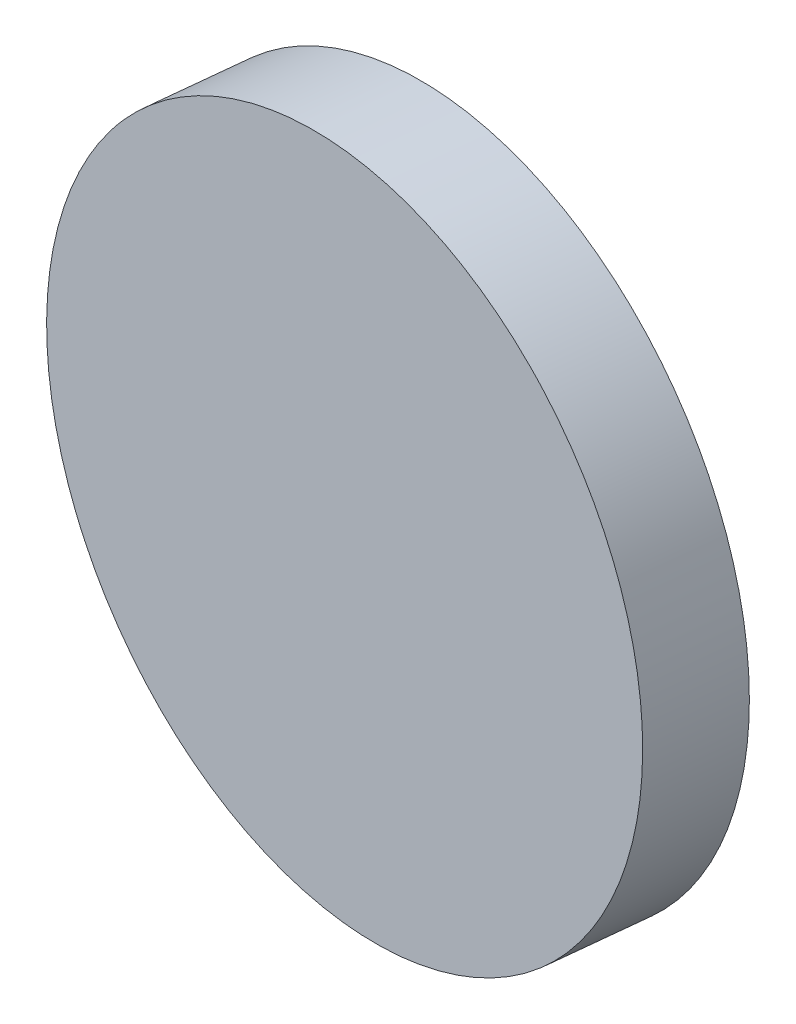
ISO-10303-21;
HEADER;
FILE_DESCRIPTION(('STEP AP214'),'2;1');
FILE_NAME('part.step','',(''),(''),'','','');
FILE_SCHEMA(('AUTOMOTIVE_DESIGN { 1 0 10303 214 1 1 1 1 }'));
ENDSEC;
DATA;
#1=APPLICATION_CONTEXT('core data for automotive mechanical design processes');
#2=APPLICATION_PROTOCOL_DEFINITION('international standard','automotive_design',2000,#1);
#3=PRODUCT_CONTEXT('',#1,'mechanical');
#4=PRODUCT('Part','Part','',(#3));
#5=PRODUCT_RELATED_PRODUCT_CATEGORY('part','',(#4));
#6=PRODUCT_DEFINITION_FORMATION('','',#4);
#7=PRODUCT_DEFINITION_CONTEXT('part definition',#1,'design');
#8=PRODUCT_DEFINITION('design','',#6,#7);
#9=PRODUCT_DEFINITION_SHAPE('','',#8);
#10=(LENGTH_UNIT() NAMED_UNIT(*) SI_UNIT(.MILLI.,.METRE.));
#11=(NAMED_UNIT(*) PLANE_ANGLE_UNIT() SI_UNIT($,.RADIAN.));
#12=(NAMED_UNIT(*) SI_UNIT($,.STERADIAN.) SOLID_ANGLE_UNIT());
#13=UNCERTAINTY_MEASURE_WITH_UNIT(LENGTH_MEASURE(1.E-05),#10,'distance_accuracy_value','');
#14=(GEOMETRIC_REPRESENTATION_CONTEXT(3) GLOBAL_UNCERTAINTY_ASSIGNED_CONTEXT((#13)) GLOBAL_UNIT_ASSIGNED_CONTEXT((#10,
#11,#12)) REPRESENTATION_CONTEXT('',''));
#15=CARTESIAN_POINT('',(0.,0.,0.));
#16=DIRECTION('',(0.,0.,1.));
#17=DIRECTION('',(1.,0.,0.));
#18=AXIS2_PLACEMENT_3D('',#15,#16,#17);
#19=CARTESIAN_POINT('',(81.5802850938321,190.866099823162,216.36105763102));
#20=CARTESIAN_POINT('',(81.5802850938321,191.240465528175,216.36105763102));
#21=CARTESIAN_POINT('',(81.5069454617178,191.989196938201,216.353349325072));
#22=CARTESIAN_POINT('',(81.1811447186027,193.06913406095,216.319106287118));
#23=CARTESIAN_POINT('',(80.6520730203906,194.064409813416,216.263498610877));
#24=CARTESIAN_POINT('',(79.9400622957371,194.93677630659,216.188663268161));
#25=CARTESIAN_POINT('',(79.0724747174903,195.652708985367,216.097476139224));
#26=CARTESIAN_POINT('',(78.0826511897335,196.184694958402,215.993441494291));
#27=CARTESIAN_POINT('',(77.0086300755391,196.512290303092,215.880557326424));
#28=CARTESIAN_POINT('',(75.8916854040075,196.622905714059,215.763161710889));
#29=CARTESIAN_POINT('',(74.7747407324759,196.512290303092,215.645766095353));
#30=CARTESIAN_POINT('',(73.7007196182815,196.184694958402,215.532881927487));
#31=CARTESIAN_POINT('',(72.7108960905247,195.652708985367,215.428847282554));
#32=CARTESIAN_POINT('',(71.8433085122779,194.93677630659,215.337660153616));
#33=CARTESIAN_POINT('',(71.1312977876244,194.064409813416,215.262824810901));
#34=CARTESIAN_POINT('',(70.6022260894123,193.06913406095,215.207217134659));
#35=CARTESIAN_POINT('',(70.2764253462972,191.989196938201,215.172974096705));
#36=CARTESIAN_POINT('',(70.1664158981257,190.866099823162,215.161411637783));
#37=CARTESIAN_POINT('',(70.2764253462972,189.743002708123,215.172974096705));
#38=CARTESIAN_POINT('',(70.6022260894123,188.663065585374,215.207217134659));
#39=CARTESIAN_POINT('',(71.1312977876244,187.667789832908,215.2628248109));
#40=CARTESIAN_POINT('',(71.8433085122779,186.795423339734,215.337660153616));
#41=CARTESIAN_POINT('',(72.7108960905248,186.079490660957,215.428847282554));
#42=CARTESIAN_POINT('',(73.7007196182815,185.547504687922,215.532881927487));
#43=CARTESIAN_POINT('',(74.7747407324759,185.219909343232,215.645766095353));
#44=CARTESIAN_POINT('',(75.8916854040075,185.109293932265,215.763161710889));
#45=CARTESIAN_POINT('',(77.0086300755391,185.219909343232,215.880557326424));
#46=CARTESIAN_POINT('',(78.0826511897336,185.547504687922,215.993441494291));
#47=CARTESIAN_POINT('',(79.0724747174903,186.079490660957,216.097476139223));
#48=CARTESIAN_POINT('',(79.9400622957371,186.795423339734,216.188663268161));
#49=CARTESIAN_POINT('',(80.6520730203906,187.667789832908,216.263498610877));
#50=CARTESIAN_POINT('',(81.1811447186027,188.663065585374,216.319106287118));
#51=CARTESIAN_POINT('',(81.5069454617179,189.743002708123,216.353349325072));
#52=CARTESIAN_POINT('',(81.5802850938322,190.491734118149,216.36105763102));
#53=CARTESIAN_POINT('',(81.5802850938321,190.866099823162,216.36105763102));
#54=B_SPLINE_CURVE_WITH_KNOTS('',3,(#19,#20,#21,#22,#23,#24,#25,#26,#27,#28,#29,#30,#31,#32,#33,
#34,#35,#36,#37,#38,#39,#40,#41,#42,#43,#44,#45,#46,#47,#48,#49,#50,#51,#52,#53),.UNSPECIFIED.,
.T.,.F.,(4,1,1,1,1,1,1,1,1,1,1,1,1,1,1,1,1,1,1,1,1,1,1,1,1,1,1,1,1,1,1,1,4),(0.,
0.0312499999999999,0.0625,0.09375,0.125,0.15625,0.1875,0.21875,0.25,0.28125,0.3125,0.34375,
0.375,0.40625,0.4375,0.46875,0.5,0.53125,0.5625,0.59375,0.625,0.65625,0.6875,0.71875,
0.750000000000001,0.78125,0.8125,0.84375,0.875,0.90625,0.9375,0.96875,1.),.UNSPECIFIED.);
#55=DIRECTION('',(-0.104528463267661,0.,0.994521895368273));
#56=VECTOR('',#55,1.);
#57=SURFACE_OF_LINEAR_EXTRUSION('',#54,#56);
#58=CARTESIAN_POINT('',(81.5802850938321,190.866099823162,216.36105763102));
#59=CARTESIAN_POINT('',(81.5802850340737,190.956855663651,216.361057624739));
#60=CARTESIAN_POINT('',(81.578129980323,191.047610899595,216.360831119463));
#61=CARTESIAN_POINT('',(81.5695298481299,191.228916404804,216.359927209146));
#62=CARTESIAN_POINT('',(81.5630847369138,191.319466672499,216.35924980066));
#63=CARTESIAN_POINT('',(81.5459244482851,191.500157147677,216.357446181647));
#64=CARTESIAN_POINT('',(81.5352092681802,191.590297354901,216.356319970836));
#65=CARTESIAN_POINT('',(81.5095294642833,191.769963271551,216.353620914686));
#66=CARTESIAN_POINT('',(81.4945648717012,191.859488985484,216.352048072626));
#67=CARTESIAN_POINT('',(81.4604038242494,192.0377202278,216.348457601858));
#68=CARTESIAN_POINT('',(81.4412073766645,192.126425757594,216.346439973915));
#69=CARTESIAN_POINT('',(81.3986385816101,192.302818386668,216.341965813265));
#70=CARTESIAN_POINT('',(81.3752662020898,192.390505478126,216.339509277189));
#71=CARTESIAN_POINT('',(81.3244056687212,192.564664551136,216.334163619724));
#72=CARTESIAN_POINT('',(81.2969175071506,192.651136530408,216.331274497523));
#73=CARTESIAN_POINT('',(81.2378854329528,192.822668878292,216.325069976508));
#74=CARTESIAN_POINT('',(81.2063415479988,192.90772925653,216.321754580603));
#75=CARTESIAN_POINT('',(81.1392539046912,193.076239760272,216.314703385157));
#76=CARTESIAN_POINT('',(81.1037101596968,193.159689891152,216.310967587021));
#77=CARTESIAN_POINT('',(81.0287116955588,193.324794465195,216.303084930802));
#78=CARTESIAN_POINT('',(80.9892569474129,193.406448895036,216.29893806967));
#79=CARTESIAN_POINT('',(80.9065346690166,193.567781384206,216.29024360786));
#80=CARTESIAN_POINT('',(80.863267127035,193.647459437454,216.285696005948));
#81=CARTESIAN_POINT('',(80.7730160847625,193.804658152998,216.276210239168));
#82=CARTESIAN_POINT('',(80.7260326071597,193.882178828463,216.271272076685));
#83=CARTESIAN_POINT('',(80.6284426810896,194.03487882202,216.261014962136));
#84=CARTESIAN_POINT('',(80.5778362499097,194.110058151281,216.255696011887));
#85=CARTESIAN_POINT('',(80.4731189883665,194.257907848106,216.244689784193));
#86=CARTESIAN_POINT('',(80.4190081340302,194.330578198501,216.239002504229));
#87=CARTESIAN_POINT('',(80.307414345985,194.473252585041,216.227273524476));
#88=CARTESIAN_POINT('',(80.2499313981075,194.54325660998,216.221231823198));
#89=CARTESIAN_POINT('',(80.1317232254755,194.680439575148,216.208807643612));
#90=CARTESIAN_POINT('',(80.0709980176521,194.747618530126,216.202425167082));
#91=CARTESIAN_POINT('',(79.9464324172946,194.878989491942,216.189332794916));
#92=CARTESIAN_POINT('',(79.8825920433064,194.943181516558,216.182622901229));
#93=CARTESIAN_POINT('',(79.7519407453651,195.068433259066,216.168890896472));
#94=CARTESIAN_POINT('',(79.6851298037314,195.12949295831,216.161868783545));
#95=CARTESIAN_POINT('',(79.5486983412002,195.248352254604,216.147529259009));
#96=CARTESIAN_POINT('',(79.4790778056342,195.306151834629,216.14021184586));
#97=CARTESIAN_POINT('',(79.3371850043124,195.418360312456,216.125298311487));
#98=CARTESIAN_POINT('',(79.2649127497004,195.472769224505,216.117702191435));
#99=CARTESIAN_POINT('',(79.1178729889843,195.578063298,216.102247689831));
#100=CARTESIAN_POINT('',(79.0431054999548,195.628948483551,216.094389310074));
#101=CARTESIAN_POINT('',(78.8912420129401,195.727075962216,216.078427814407));
#102=CARTESIAN_POINT('',(78.8141460038466,195.774318237948,216.070324697329));
#103=CARTESIAN_POINT('',(78.6578084393137,195.865066408193,216.053892957165));
#104=CARTESIAN_POINT('',(78.5785668707781,195.908572279892,216.045564332703));
#105=CARTESIAN_POINT('',(78.4181181778651,195.991750215723,216.028700495535));
#106=CARTESIAN_POINT('',(78.3369110595362,196.031422291652,216.020165283465));
#107=CARTESIAN_POINT('',(78.1727109456204,196.106833868298,216.002907156061));
#108=CARTESIAN_POINT('',(78.089717963282,196.142573398178,215.99418424212));
#109=CARTESIAN_POINT('',(77.9221305777298,196.210030578977,215.976570098122));
#110=CARTESIAN_POINT('',(77.8375361691684,196.241748216463,215.967678867502));
#111=CARTESIAN_POINT('',(77.6669434933656,196.301105455841,215.94974885477));
#112=CARTESIAN_POINT('',(77.5809452165498,196.328745029906,215.940710071651));
#113=CARTESIAN_POINT('',(77.4077402054212,196.379885717267,215.922505491412));
#114=CARTESIAN_POINT('',(77.3205334733762,196.403386838327,215.913339694531));
#115=CARTESIAN_POINT('',(77.1451071406214,196.446190114371,215.894901643981));
#116=CARTESIAN_POINT('',(77.056887547691,196.465492301583,215.885629391131));
#117=CARTESIAN_POINT('',(76.8796326783479,196.499841517015,215.866999153641));
#118=CARTESIAN_POINT('',(76.7905974005313,196.51488853791,215.857641168855));
#119=CARTESIAN_POINT('',(76.611915699216,196.540709795658,215.838860965282));
#120=CARTESIAN_POINT('',(76.5222692712336,196.551484001128,215.829438746024));
#121=CARTESIAN_POINT('',(76.34256868723,196.568738804796,215.810551453566));
#122=CARTESIAN_POINT('',(76.2525145314659,196.5752194057,215.801086380392));
#123=CARTESIAN_POINT('',(76.0722020507603,196.583866942027,215.782134774998));
#124=CARTESIAN_POINT('',(75.9819437273839,196.586033910403,215.772648242944));
#125=CARTESIAN_POINT('',(75.8014270806311,196.586033910403,215.753675178834));
#126=CARTESIAN_POINT('',(75.7111687572547,196.583866942027,215.744188646779));
#127=CARTESIAN_POINT('',(75.5308562765491,196.5752194057,215.725237041386));
#128=CARTESIAN_POINT('',(75.440802120785,196.568738804796,215.715771968212));
#129=CARTESIAN_POINT('',(75.2611015367814,196.551484001128,215.696884675753));
#130=CARTESIAN_POINT('',(75.171455108799,196.540709795658,215.687462456496));
#131=CARTESIAN_POINT('',(74.9927734074837,196.51488853791,215.668682252923));
#132=CARTESIAN_POINT('',(74.9037381296671,196.499841517015,215.659324268136));
#133=CARTESIAN_POINT('',(74.726483260324,196.465492301583,215.640694030647));
#134=CARTESIAN_POINT('',(74.6382636673936,196.446190114371,215.631421777797));
#135=CARTESIAN_POINT('',(74.4628373346388,196.403386838327,215.612983727247));
#136=CARTESIAN_POINT('',(74.3756306025938,196.379885717267,215.603817930365));
#137=CARTESIAN_POINT('',(74.2024255914652,196.328745029906,215.585613350126));
#138=CARTESIAN_POINT('',(74.1164273146494,196.301105455841,215.576574567008));
#139=CARTESIAN_POINT('',(73.9458346388466,196.241748216463,215.558644554275));
#140=CARTESIAN_POINT('',(73.8612402302852,196.210030578977,215.549753323656));
#141=CARTESIAN_POINT('',(73.693652844733,196.142573398178,215.532139179657));
#142=CARTESIAN_POINT('',(73.6106598623946,196.106833868298,215.523416265716));
#143=CARTESIAN_POINT('',(73.4464597484788,196.031422291652,215.506158138312));
#144=CARTESIAN_POINT('',(73.3652526301499,195.991750215723,215.497622926242));
#145=CARTESIAN_POINT('',(73.2048039372369,195.908572279892,215.480759089074));
#146=CARTESIAN_POINT('',(73.1255623687013,195.865066408193,215.472430464612));
#147=CARTESIAN_POINT('',(72.9692248041684,195.774318237948,215.455998724449));
#148=CARTESIAN_POINT('',(72.8921287950749,195.727075962216,215.447895607371));
#149=CARTESIAN_POINT('',(72.7402653080603,195.628948483551,215.431934111703));
#150=CARTESIAN_POINT('',(72.6654978190307,195.578063298,215.424075731946));
#151=CARTESIAN_POINT('',(72.5184580583146,195.472769224505,215.408621230342));
#152=CARTESIAN_POINT('',(72.4461858037026,195.418360312456,215.40102511029));
#153=CARTESIAN_POINT('',(72.3042930023808,195.306151834628,215.386111575918));
#154=CARTESIAN_POINT('',(72.2346724668148,195.248352254604,215.378794162768));
#155=CARTESIAN_POINT('',(72.0982410042836,195.12949295831,215.364454638233));
#156=CARTESIAN_POINT('',(72.0314300626499,195.068433259066,215.357432525305));
#157=CARTESIAN_POINT('',(71.9007787647086,194.943181516557,215.343700520548));
#158=CARTESIAN_POINT('',(71.8369383907204,194.878989491942,215.336990626861));
#159=CARTESIAN_POINT('',(71.7123727903629,194.747618530126,215.323898254695));
#160=CARTESIAN_POINT('',(71.6516475825395,194.680439575148,215.317515778166));
#161=CARTESIAN_POINT('',(71.5334394099075,194.54325660998,215.305091598579));
#162=CARTESIAN_POINT('',(71.47595646203,194.473252585041,215.299049897302));
#163=CARTESIAN_POINT('',(71.3643626739848,194.330578198501,215.287320917549));
#164=CARTESIAN_POINT('',(71.3102518196485,194.257907848106,215.281633637584));
#165=CARTESIAN_POINT('',(71.2055345581053,194.110058151281,215.270627409891));
#166=CARTESIAN_POINT('',(71.1549281269254,194.03487882202,215.265308459642));
#167=CARTESIAN_POINT('',(71.0573382008554,193.882178828463,215.255051345093));
#168=CARTESIAN_POINT('',(71.0103547232526,193.804658152998,215.250113182609));
#169=CARTESIAN_POINT('',(70.92010368098,193.647459437454,215.240627415829));
#170=CARTESIAN_POINT('',(70.8768361389983,193.567781384206,215.236079813917));
#171=CARTESIAN_POINT('',(70.7941138606023,193.406448895036,215.227385352107));
#172=CARTESIAN_POINT('',(70.7546591124567,193.324794465197,215.223238490976));
#173=CARTESIAN_POINT('',(70.6796606483178,193.159689891149,215.215355834756));
#174=CARTESIAN_POINT('',(70.6441169033222,193.076239760263,215.21162003662));
#175=CARTESIAN_POINT('',(70.5770292600178,192.907729256539,215.204568841175));
#176=CARTESIAN_POINT('',(70.5454853750681,192.822668878326,215.20125344527));
#177=CARTESIAN_POINT('',(70.4864533008585,192.651136530374,215.195048924254));
#178=CARTESIAN_POINT('',(70.4589651392717,192.564664551007,215.192159802051));
#179=CARTESIAN_POINT('',(70.4081046059473,192.390505478255,215.186814144591));
#180=CARTESIAN_POINT('',(70.3847322264874,192.30281838715,215.184357608522));
#181=CARTESIAN_POINT('',(70.342163431268,192.126425757112,215.179883447854));
#182=CARTESIAN_POINT('',(70.3229669834575,192.037720226001,215.177865819887));
#183=CARTESIAN_POINT('',(70.2888059366219,191.859488987283,215.174275349183));
#184=CARTESIAN_POINT('',(70.2738413448813,191.769963278265,215.172702507212));
#185=CARTESIAN_POINT('',(70.2481615386852,191.590297348187,215.17000345082));
#186=CARTESIAN_POINT('',(70.2374463554394,191.500157122617,215.16887723968));
#187=CARTESIAN_POINT('',(70.2202860753917,191.319466697559,215.167073621568));
#188=CARTESIAN_POINT('',(70.2138409758975,191.228916498329,215.166396214315));
#189=CARTESIAN_POINT('',(70.2052408116797,191.047610806071,215.165492300631));
#190=CARTESIAN_POINT('',(70.2030857141828,190.956855314616,215.165265790757));
#191=CARTESIAN_POINT('',(70.2030857141828,190.775344331707,215.165265790757));
#192=CARTESIAN_POINT('',(70.2052408116797,190.684588840253,215.165492300631));
#193=CARTESIAN_POINT('',(70.2138409758975,190.503283147995,215.166396214315));
#194=CARTESIAN_POINT('',(70.2202860753917,190.412732948765,215.167073621568));
#195=CARTESIAN_POINT('',(70.2374463554394,190.232042523707,215.16887723968));
#196=CARTESIAN_POINT('',(70.2481615386852,190.141902298137,215.17000345082));
#197=CARTESIAN_POINT('',(70.2738413448813,189.962236368058,215.172702507212));
#198=CARTESIAN_POINT('',(70.2888059366219,189.87271065904,215.174275349183));
#199=CARTESIAN_POINT('',(70.3229669834575,189.694479420323,215.177865819887));
#200=CARTESIAN_POINT('',(70.342163431268,189.605773889212,215.179883447854));
#201=CARTESIAN_POINT('',(70.3847322264874,189.429381259173,215.184357608522));
#202=CARTESIAN_POINT('',(70.4081046059473,189.341694168068,215.186814144591));
#203=CARTESIAN_POINT('',(70.4589651392717,189.167535095317,215.192159802051));
#204=CARTESIAN_POINT('',(70.4864533008585,189.08106311595,215.195048924254));
#205=CARTESIAN_POINT('',(70.5454853750681,188.909530767998,215.20125344527));
#206=CARTESIAN_POINT('',(70.5770292600178,188.824470389784,215.204568841175));
#207=CARTESIAN_POINT('',(70.6441169033222,188.655959886061,215.21162003662));
#208=CARTESIAN_POINT('',(70.6796606483178,188.572509755174,215.215355834756));
#209=CARTESIAN_POINT('',(70.7546591124567,188.407405181127,215.223238490976));
#210=CARTESIAN_POINT('',(70.7941138606023,188.325750751288,215.227385352107));
#211=CARTESIAN_POINT('',(70.8768361389984,188.164418262118,215.236079813917));
#212=CARTESIAN_POINT('',(70.92010368098,188.08474020887,215.240627415829));
#213=CARTESIAN_POINT('',(71.0103547232526,187.927541493326,215.250113182609));
#214=CARTESIAN_POINT('',(71.0573382008554,187.850020817861,215.255051345093));
#215=CARTESIAN_POINT('',(71.1549281269254,187.697320824304,215.265308459642));
#216=CARTESIAN_POINT('',(71.2055345581054,187.622141495043,215.27062740989));
#217=CARTESIAN_POINT('',(71.3102518196485,187.474291798218,215.281633637584));
#218=CARTESIAN_POINT('',(71.3643626739849,187.401621447823,215.287320917549));
#219=CARTESIAN_POINT('',(71.4759564620301,187.258947061283,215.299049897302));
#220=CARTESIAN_POINT('',(71.5334394099075,187.188943036344,215.305091598579));
#221=CARTESIAN_POINT('',(71.6516475825396,187.051760071176,215.317515778166));
#222=CARTESIAN_POINT('',(71.712372790363,186.984581116198,215.323898254695));
#223=CARTESIAN_POINT('',(71.8369383907205,186.853210154382,215.336990626861));
#224=CARTESIAN_POINT('',(71.9007787647086,186.789018129766,215.343700520548));
#225=CARTESIAN_POINT('',(72.0314300626499,186.663766387258,215.357432525305));
#226=CARTESIAN_POINT('',(72.0982410042836,186.602706688013,215.364454638233));
#227=CARTESIAN_POINT('',(72.2346724668148,186.48384739172,215.378794162768));
#228=CARTESIAN_POINT('',(72.3042930023808,186.426047811695,215.386111575918));
#229=CARTESIAN_POINT('',(72.4461858037026,186.313839333868,215.40102511029));
#230=CARTESIAN_POINT('',(72.5184580583146,186.259430421819,215.408621230342));
#231=CARTESIAN_POINT('',(72.6654978190308,186.154136348324,215.424075731946));
#232=CARTESIAN_POINT('',(72.7402653080603,186.103251162773,215.431934111703));
#233=CARTESIAN_POINT('',(72.8921287950749,186.005123684108,215.447895607371));
#234=CARTESIAN_POINT('',(72.9692248041684,185.957881408375,215.455998724448));
#235=CARTESIAN_POINT('',(73.1255623687013,185.867133238131,215.472430464612));
#236=CARTESIAN_POINT('',(73.2048039372369,185.823627366432,215.480759089074));
#237=CARTESIAN_POINT('',(73.3652526301499,185.740449430601,215.497622926242));
#238=CARTESIAN_POINT('',(73.4464597484788,185.700777354672,215.506158138312));
#239=CARTESIAN_POINT('',(73.6106598623947,185.625365778026,215.523416265716));
#240=CARTESIAN_POINT('',(73.693652844733,185.589626248146,215.532139179657));
#241=CARTESIAN_POINT('',(73.8612402302852,185.522169067347,215.549753323656));
#242=CARTESIAN_POINT('',(73.9458346388466,185.490451429861,215.558644554275));
#243=CARTESIAN_POINT('',(74.1164273146494,185.431094190483,215.576574567007));
#244=CARTESIAN_POINT('',(74.2024255914652,185.403454616417,215.585613350126));
#245=CARTESIAN_POINT('',(74.3756306025938,185.352313929057,215.603817930365));
#246=CARTESIAN_POINT('',(74.4628373346388,185.328812807997,215.612983727247));
#247=CARTESIAN_POINT('',(74.6382636673936,185.286009531953,215.631421777796));
#248=CARTESIAN_POINT('',(74.726483260324,185.266707344741,215.640694030647));
#249=CARTESIAN_POINT('',(74.9037381296671,185.232358129309,215.659324268136));
#250=CARTESIAN_POINT('',(74.9927734074837,185.217311108414,215.668682252923));
#251=CARTESIAN_POINT('',(75.171455108799,185.191489850666,215.687462456495));
#252=CARTESIAN_POINT('',(75.2611015367814,185.180715645195,215.696884675753));
#253=CARTESIAN_POINT('',(75.440802120785,185.163460841528,215.715771968211));
#254=CARTESIAN_POINT('',(75.5308562765492,185.156980240624,215.725237041385));
#255=CARTESIAN_POINT('',(75.7111687572547,185.148332704297,215.744188646779));
#256=CARTESIAN_POINT('',(75.8014270806311,185.146165735921,215.753675178834));
#257=CARTESIAN_POINT('',(75.9819437273839,185.146165735921,215.772648242943));
#258=CARTESIAN_POINT('',(76.0722020507603,185.148332704297,215.782134774998));
#259=CARTESIAN_POINT('',(76.2525145314659,185.156980240624,215.801086380392));
#260=CARTESIAN_POINT('',(76.34256868723,185.163460841528,215.810551453566));
#261=CARTESIAN_POINT('',(76.5222692712336,185.180715645195,215.829438746024));
#262=CARTESIAN_POINT('',(76.611915699216,185.191489850666,215.838860965282));
#263=CARTESIAN_POINT('',(76.7905974005313,185.217311108414,215.857641168854));
#264=CARTESIAN_POINT('',(76.8796326783479,185.232358129309,215.866999153641));
#265=CARTESIAN_POINT('',(77.056887547691,185.266707344741,215.88562939113));
#266=CARTESIAN_POINT('',(77.1451071406215,185.286009531953,215.894901643981));
#267=CARTESIAN_POINT('',(77.3205334733762,185.328812807997,215.91333969453));
#268=CARTESIAN_POINT('',(77.4077402054212,185.352313929057,215.922505491412));
#269=CARTESIAN_POINT('',(77.5809452165498,185.403454616418,215.940710071651));
#270=CARTESIAN_POINT('',(77.6669434933657,185.431094190483,215.94974885477));
#271=CARTESIAN_POINT('',(77.8375361691685,185.490451429861,215.967678867502));
#272=CARTESIAN_POINT('',(77.9221305777299,185.522169067347,215.976570098122));
#273=CARTESIAN_POINT('',(78.0897179632821,185.589626248146,215.99418424212));
#274=CARTESIAN_POINT('',(78.1727109456204,185.625365778026,216.002907156061));
#275=CARTESIAN_POINT('',(78.3369110595363,185.700777354672,216.020165283465));
#276=CARTESIAN_POINT('',(78.4181181778651,185.740449430601,216.028700495535));
#277=CARTESIAN_POINT('',(78.5785668707781,185.823627366432,216.045564332703));
#278=CARTESIAN_POINT('',(78.6578084393137,185.867133238131,216.053892957165));
#279=CARTESIAN_POINT('',(78.8141460038467,185.957881408375,216.070324697329));
#280=CARTESIAN_POINT('',(78.8912420129402,186.005123684108,216.078427814407));
#281=CARTESIAN_POINT('',(79.0431054999548,186.103251162773,216.094389310074));
#282=CARTESIAN_POINT('',(79.1178729889843,186.154136348324,216.102247689831));
#283=CARTESIAN_POINT('',(79.2649127497005,186.259430421819,216.117702191435));
#284=CARTESIAN_POINT('',(79.3371850043125,186.313839333868,216.125298311487));
#285=CARTESIAN_POINT('',(79.4790778056342,186.426047811695,216.140211845859));
#286=CARTESIAN_POINT('',(79.5486983412002,186.48384739172,216.147529259009));
#287=CARTESIAN_POINT('',(79.6851298037314,186.602706688013,216.161868783545));
#288=CARTESIAN_POINT('',(79.7519407453651,186.663766387258,216.168890896472));
#289=CARTESIAN_POINT('',(79.8825920433064,186.789018129766,216.182622901229));
#290=CARTESIAN_POINT('',(79.9464324172946,186.853210154382,216.189332794916));
#291=CARTESIAN_POINT('',(80.0709980176521,186.984581116198,216.202425167082));
#292=CARTESIAN_POINT('',(80.1317232254755,187.051760071176,216.208807643612));
#293=CARTESIAN_POINT('',(80.2499313981075,187.188943036344,216.221231823198));
#294=CARTESIAN_POINT('',(80.307414345985,187.258947061283,216.227273524476));
#295=CARTESIAN_POINT('',(80.4190081340302,187.401621447823,216.239002504229));
#296=CARTESIAN_POINT('',(80.4731189883665,187.474291798218,216.244689784193));
#297=CARTESIAN_POINT('',(80.5778362499097,187.622141495043,216.255696011887));
#298=CARTESIAN_POINT('',(80.6284426810896,187.697320824304,216.261014962135));
#299=CARTESIAN_POINT('',(80.7260326071597,187.850020817861,216.271272076685));
#300=CARTESIAN_POINT('',(80.7730160847625,187.927541493326,216.276210239168));
#301=CARTESIAN_POINT('',(80.863267127035,188.08474020887,216.285696005948));
#302=CARTESIAN_POINT('',(80.9065346690166,188.164418262118,216.29024360786));
#303=CARTESIAN_POINT('',(80.9892569474129,188.325750751288,216.29893806967));
#304=CARTESIAN_POINT('',(81.0287116955588,188.407405181129,216.303084930802));
#305=CARTESIAN_POINT('',(81.1037101596968,188.572509755172,216.310967587021));
#306=CARTESIAN_POINT('',(81.1392539046912,188.655959886052,216.314703385157));
#307=CARTESIAN_POINT('',(81.2063415479988,188.824470389794,216.321754580603));
#308=CARTESIAN_POINT('',(81.2378854329529,188.909530768032,216.325069976508));
#309=CARTESIAN_POINT('',(81.2969175071506,189.081063115916,216.331274497523));
#310=CARTESIAN_POINT('',(81.3244056687213,189.167535095188,216.334163619724));
#311=CARTESIAN_POINT('',(81.3752662020898,189.341694168198,216.339509277189));
#312=CARTESIAN_POINT('',(81.3986385816102,189.429381259655,216.341965813265));
#313=CARTESIAN_POINT('',(81.4412073766645,189.60577388873,216.346439973915));
#314=CARTESIAN_POINT('',(81.4604038242495,189.694479418524,216.348457601858));
#315=CARTESIAN_POINT('',(81.4945648717012,189.87271066084,216.352048072626));
#316=CARTESIAN_POINT('',(81.5095294642833,189.962236374773,216.353620914686));
#317=CARTESIAN_POINT('',(81.5352092681802,190.141902291423,216.356319970836));
#318=CARTESIAN_POINT('',(81.5459244482851,190.232042498647,216.357446181647));
#319=CARTESIAN_POINT('',(81.5630847369139,190.412732973825,216.35924980066));
#320=CARTESIAN_POINT('',(81.5695298481299,190.50328324152,216.359927209146));
#321=CARTESIAN_POINT('',(81.5781299803231,190.684588746729,216.360831119463));
#322=CARTESIAN_POINT('',(81.5802850340738,190.775343982672,216.361057624739));
#323=CARTESIAN_POINT('',(81.5802850938321,190.866099823162,216.36105763102));
#324=B_SPLINE_CURVE_WITH_KNOTS('',3,(#58,#59,#60,#61,#62,#63,#64,#65,#66,#67,#68,#69,#70,#71,
#72,#73,#74,#75,#76,#77,#78,#79,#80,#81,#82,#83,#84,#85,#86,#87,#88,#89,#90,#91,#92,#93,#94,#95,
#96,#97,#98,#99,#100,#101,#102,#103,#104,#105,#106,#107,#108,#109,#110,#111,#112,#113,#114,#115,
#116,#117,#118,#119,#120,#121,#122,#123,#124,#125,#126,#127,#128,#129,#130,#131,#132,#133,#134,
#135,#136,#137,#138,#139,#140,#141,#142,#143,#144,#145,#146,#147,#148,#149,#150,#151,#152,#153,
#154,#155,#156,#157,#158,#159,#160,#161,#162,#163,#164,#165,#166,#167,#168,#169,#170,#171,#172,
#173,#174,#175,#176,#177,#178,#179,#180,#181,#182,#183,#184,#185,#186,#187,#188,#189,#190,#191,
#192,#193,#194,#195,#196,#197,#198,#199,#200,#201,#202,#203,#204,#205,#206,#207,#208,#209,#210,
#211,#212,#213,#214,#215,#216,#217,#218,#219,#220,#221,#222,#223,#224,#225,#226,#227,#228,#229,
#230,#231,#232,#233,#234,#235,#236,#237,#238,#239,#240,#241,#242,#243,#244,#245,#246,#247,#248,
#249,#250,#251,#252,#253,#254,#255,#256,#257,#258,#259,#260,#261,#262,#263,#264,#265,#266,#267,
#268,#269,#270,#271,#272,#273,#274,#275,#276,#277,#278,#279,#280,#281,#282,#283,#284,#285,#286,
#287,#288,#289,#290,#291,#292,#293,#294,#295,#296,#297,#298,#299,#300,#301,#302,#303,#304,#305,
#306,#307,#308,#309,#310,#311,#312,#313,#314,#315,#316,#317,#318,#319,#320,#321,#322,#323),
.UNSPECIFIED.,.F.,.F.,(4,2,2,2,2,2,2,2,2,2,2,2,2,2,2,2,2,2,2,2,2,2,2,2,2,2,2,2,2,2,2,2,2,2,2,2,
2,2,2,2,2,2,2,2,2,2,2,2,2,2,2,2,2,2,2,2,2,2,2,2,2,2,2,2,2,2,2,2,2,2,2,2,2,2,2,2,2,2,2,2,2,2,2,2,
2,2,2,2,2,2,2,2,2,2,2,2,2,2,2,2,2,2,2,2,2,2,2,2,2,2,2,2,2,2,2,2,2,2,2,2,2,2,2,2,2,2,2,2,2,2,2,2,
4),(0.,0.272240869082034,0.544483817952296,0.816726938463756,1.08896805953153,1.36120871196941,
1.6334514539914,1.90569470682849,2.17793610219294,2.45017658832663,2.7224190934287,
2.99466243619474,3.26690411686854,3.53914449859525,3.81138674286833,4.0836301311124,
4.35587209783704,4.62811244399058,4.90035441071529,5.17259779895934,5.44484004323234,
5.7170804249591,5.98932210563291,6.26156544839893,6.533807953501,6.80604843963466,
7.07828983499911,7.35053308783622,7.62277582985821,7.89501648229613,8.16725760336389,
8.43950072387535,8.71174367274561,8.98398454182765,9.25622541090968,9.52846835977995,
9.80071148029141,10.0729526013592,10.3451932537971,10.6174359958191,10.8896792486562,
11.1619206440206,11.4341611301543,11.7064036352564,11.9786469780224,12.2508886586962,
12.523129040423,12.795371284696,13.06761467294,13.3398566396647,13.6120969858183,
13.8843389525429,14.156582340787,14.42882458506,14.7010649667867,14.9733066474605,
15.2455499902266,15.5177924953286,15.7900329814623,16.0622743768267,16.3345176296639,
16.6067603716859,16.8790010241238,17.1512421451916,17.423485265703,17.6957282145733,
17.9679690836553,18.2402099527373,18.5124529016077,18.7846960221191,19.0569371431868,
19.3291777956247,19.6014205376467,19.8736637904838,20.1459051858483,20.418145671982,
20.690388177084,20.96263151985,21.2348732005238,21.5071135822506,21.7793558265236,
22.0515992147676,22.3238411814923,22.5960815276459,22.8683234943706,23.1405668826146,
23.4128091268877,23.6850495086144,23.9572911892882,24.2295345320542,24.5017770371563,
24.77401752329,25.0462589186544,25.3185021714915,25.5907449135135,25.8629855659514,
26.1352266870192,26.4074698075306,26.6797127564009,26.9519536254829,27.224194494565,
27.4964374434352,27.7686805639467,28.0409216850144,28.3131623374524,28.5854050794744,
28.8576483323115,29.1298897276759,29.4021302138096,29.6743727189117,29.9466160616777,
30.2188577423515,30.4910981240783,30.7633403683513,31.0355837565954,31.30782572332,
31.5800660694736,31.8523080361983,32.1245514244423,32.3967936687153,32.669034050442,
32.9412757311158,33.2135190738819,33.4857615789839,33.7580020651176,34.0302434604821,
34.3024867133192,34.5747294553412,34.8469701077791,35.1192112288468,35.3914543493583,
35.6636972982285,35.9359381673106),.UNSPECIFIED.);
#325=CARTESIAN_POINT('',(81.5802850938321,190.866099823162,216.36105763102));
#326=VERTEX_POINT('',#325);
#327=EDGE_CURVE('E9',#326,#326,#324,.T.);
#328=ORIENTED_EDGE('',*,*,#327,.T.);
#329=EDGE_LOOP('',(#328));
#330=FACE_BOUND('',#329,.T.);
#331=CARTESIAN_POINT('',(81.4069438410186,190.866099823162,218.010289485239));
#332=CARTESIAN_POINT('',(81.4069437812603,190.775343982672,218.010289478958));
#333=CARTESIAN_POINT('',(81.4047887275096,190.684588746729,218.010062973682));
#334=CARTESIAN_POINT('',(81.3961885953164,190.50328324152,218.009159063365));
#335=CARTESIAN_POINT('',(81.3897434841004,190.412732973825,218.008481654879));
#336=CARTESIAN_POINT('',(81.3725831954716,190.232042498647,218.006678035866));
#337=CARTESIAN_POINT('',(81.3618680153667,190.141902291422,218.005551825055));
#338=CARTESIAN_POINT('',(81.3361882114698,189.962236374773,218.002852768905));
#339=CARTESIAN_POINT('',(81.3212236188877,189.87271066084,218.001279926845));
#340=CARTESIAN_POINT('',(81.287062571436,189.694479418524,217.997689456077));
#341=CARTESIAN_POINT('',(81.267866123851,189.60577388873,217.995671828134));
#342=CARTESIAN_POINT('',(81.2252973287967,189.429381259655,217.991197667484));
#343=CARTESIAN_POINT('',(81.2019249492763,189.341694168198,217.988741131408));
#344=CARTESIAN_POINT('',(81.1510644159078,189.167535095188,217.983395473943));
#345=CARTESIAN_POINT('',(81.1235762543371,189.081063115916,217.980506351742));
#346=CARTESIAN_POINT('',(81.0645441801394,188.909530768032,217.974301830727));
#347=CARTESIAN_POINT('',(81.0330002951853,188.824470389794,217.970986434822));
#348=CARTESIAN_POINT('',(80.9659126518777,188.655959886052,217.963935239376));
#349=CARTESIAN_POINT('',(80.9303689068833,188.572509755172,217.96019944124));
#350=CARTESIAN_POINT('',(80.8553704427453,188.407405181129,217.952316785021));
#351=CARTESIAN_POINT('',(80.8159156945994,188.325750751288,217.948169923889));
#352=CARTESIAN_POINT('',(80.7331934162031,188.164418262118,217.939475462079));
#353=CARTESIAN_POINT('',(80.6899258742215,188.08474020887,217.934927860167));
#354=CARTESIAN_POINT('',(80.599674831949,187.927541493326,217.925442093387));
#355=CARTESIAN_POINT('',(80.5526913543462,187.850020817861,217.920503930904));
#356=CARTESIAN_POINT('',(80.4551014282761,187.697320824304,217.910246816355));
#357=CARTESIAN_POINT('',(80.4044949970962,187.622141495043,217.904927866106));
#358=CARTESIAN_POINT('',(80.299777735553,187.474291798218,217.893921638412));
#359=CARTESIAN_POINT('',(80.2456668812167,187.401621447822,217.888234358448));
#360=CARTESIAN_POINT('',(80.1340730931715,187.258947061283,217.876505378695));
#361=CARTESIAN_POINT('',(80.076590145294,187.188943036344,217.870463677417));
#362=CARTESIAN_POINT('',(79.958381972662,187.051760071176,217.858039497831));
#363=CARTESIAN_POINT('',(79.8976567648386,186.984581116198,217.851657021301));
#364=CARTESIAN_POINT('',(79.7730911644811,186.853210154382,217.838564649135));
#365=CARTESIAN_POINT('',(79.7092507904929,186.789018129766,217.831854755448));
#366=CARTESIAN_POINT('',(79.5785994925516,186.663766387258,217.818122750691));
#367=CARTESIAN_POINT('',(79.5117885509179,186.602706688013,217.811100637764));
#368=CARTESIAN_POINT('',(79.3753570883867,186.48384739172,217.796761113228));
#369=CARTESIAN_POINT('',(79.3057365528207,186.426047811695,217.789443700079));
#370=CARTESIAN_POINT('',(79.1638437514989,186.313839333868,217.774530165706));
#371=CARTESIAN_POINT('',(79.0915714968869,186.259430421819,217.766934045654));
#372=CARTESIAN_POINT('',(78.9445317361708,186.154136348324,217.75147954405));
#373=CARTESIAN_POINT('',(78.8697642471413,186.103251162773,217.743621164293));
#374=CARTESIAN_POINT('',(78.7179007601267,186.005123684108,217.727659668626));
#375=CARTESIAN_POINT('',(78.6408047510331,185.957881408375,217.719556551548));
#376=CARTESIAN_POINT('',(78.4844671865002,185.867133238131,217.703124811384));
#377=CARTESIAN_POINT('',(78.4052256179646,185.823627366432,217.694796186922));
#378=CARTESIAN_POINT('',(78.2447769250516,185.740449430601,217.677932349754));
#379=CARTESIAN_POINT('',(78.1635698067228,185.700777354672,217.669397137684));
#380=CARTESIAN_POINT('',(77.9993696928069,185.625365778026,217.65213901028));
#381=CARTESIAN_POINT('',(77.9163767104686,185.589626248146,217.643416096339));
#382=CARTESIAN_POINT('',(77.7487893249163,185.522169067347,217.625801952341));
#383=CARTESIAN_POINT('',(77.664194916355,185.490451429861,217.616910721721));
#384=CARTESIAN_POINT('',(77.4936022405521,185.431094190483,217.598980708989));
#385=CARTESIAN_POINT('',(77.4076039637363,185.403454616418,217.58994192587));
#386=CARTESIAN_POINT('',(77.2343989526077,185.352313929057,217.571737345631));
#387=CARTESIAN_POINT('',(77.1471922205627,185.328812807997,217.562571548749));
#388=CARTESIAN_POINT('',(76.9717658878079,185.286009531953,217.5441334982));
#389=CARTESIAN_POINT('',(76.8835462948775,185.266707344741,217.534861245349));
#390=CARTESIAN_POINT('',(76.7062914255344,185.232358129309,217.51623100786));
#391=CARTESIAN_POINT('',(76.6172561477178,185.217311108414,217.506873023073));
#392=CARTESIAN_POINT('',(76.4385744464025,185.191489850666,217.488092819501));
#393=CARTESIAN_POINT('',(76.3489280184201,185.180715645195,217.478670600243));
#394=CARTESIAN_POINT('',(76.1692274344165,185.163460841528,217.459783307785));
#395=CARTESIAN_POINT('',(76.0791732786523,185.156980240624,217.450318234611));
#396=CARTESIAN_POINT('',(75.8988607979468,185.148332704297,217.431366629217));
#397=CARTESIAN_POINT('',(75.8086024745704,185.146165735921,217.421880097163));
#398=CARTESIAN_POINT('',(75.6280858278176,185.146165735921,217.402907033053));
#399=CARTESIAN_POINT('',(75.5378275044412,185.148332704297,217.393420500998));
#400=CARTESIAN_POINT('',(75.3575150237356,185.156980240624,217.374468895605));
#401=CARTESIAN_POINT('',(75.2674608679715,185.163460841528,217.36500382243));
#402=CARTESIAN_POINT('',(75.0877602839679,185.180715645195,217.346116529972));
#403=CARTESIAN_POINT('',(74.9981138559855,185.191489850666,217.336694310715));
#404=CARTESIAN_POINT('',(74.8194321546702,185.217311108414,217.317914107142));
#405=CARTESIAN_POINT('',(74.7303968768536,185.232358129309,217.308556122355));
#406=CARTESIAN_POINT('',(74.5531420075105,185.266707344741,217.289925884866));
#407=CARTESIAN_POINT('',(74.4649224145801,185.286009531953,217.280653632015));
#408=CARTESIAN_POINT('',(74.2894960818253,185.328812807997,217.262215581466));
#409=CARTESIAN_POINT('',(74.2022893497803,185.352313929057,217.253049784584));
#410=CARTESIAN_POINT('',(74.0290843386517,185.403454616417,217.234845204345));
#411=CARTESIAN_POINT('',(73.9430860618359,185.431094190483,217.225806421226));
#412=CARTESIAN_POINT('',(73.7724933860331,185.490451429861,217.207876408494));
#413=CARTESIAN_POINT('',(73.6878989774717,185.522169067347,217.198985177875));
#414=CARTESIAN_POINT('',(73.5203115919195,185.589626248146,217.181371033876));
#415=CARTESIAN_POINT('',(73.4373186095811,185.625365778026,217.172648119935));
#416=CARTESIAN_POINT('',(73.2731184956653,185.700777354672,217.155389992531));
#417=CARTESIAN_POINT('',(73.1919113773364,185.740449430601,217.146854780461));
#418=CARTESIAN_POINT('',(73.0314626844234,185.823627366432,217.129990943293));
#419=CARTESIAN_POINT('',(72.9522211158878,185.867133238131,217.121662318831));
#420=CARTESIAN_POINT('',(72.7958835513549,185.957881408375,217.105230578667));
#421=CARTESIAN_POINT('',(72.7187875422614,186.005123684108,217.09712746159));
#422=CARTESIAN_POINT('',(72.5669240552468,186.103251162773,217.081165965922));
#423=CARTESIAN_POINT('',(72.4921565662173,186.154136348324,217.073307586165));
#424=CARTESIAN_POINT('',(72.3451168055011,186.259430421819,217.057853084561));
#425=CARTESIAN_POINT('',(72.2728445508891,186.313839333868,217.050256964509));
#426=CARTESIAN_POINT('',(72.1309517495673,186.426047811695,217.035343430137));
#427=CARTESIAN_POINT('',(72.0613312140013,186.48384739172,217.028026016987));
#428=CARTESIAN_POINT('',(71.9248997514701,186.602706688013,217.013686492452));
#429=CARTESIAN_POINT('',(71.8580888098364,186.663766387258,217.006664379524));
#430=CARTESIAN_POINT('',(71.7274375118951,186.789018129766,216.992932374767));
#431=CARTESIAN_POINT('',(71.663597137907,186.853210154382,216.98622248108));
#432=CARTESIAN_POINT('',(71.5390315375495,186.984581116198,216.973130108914));
#433=CARTESIAN_POINT('',(71.4783063297261,187.051760071176,216.966747632385));
#434=CARTESIAN_POINT('',(71.360098157094,187.188943036344,216.954323452798));
#435=CARTESIAN_POINT('',(71.3026152092165,187.258947061283,216.948281751521));
#436=CARTESIAN_POINT('',(71.1910214211714,187.401621447823,216.936552771768));
#437=CARTESIAN_POINT('',(71.136910566835,187.474291798218,216.930865491803));
#438=CARTESIAN_POINT('',(71.0321933052919,187.622141495043,216.91985926411));
#439=CARTESIAN_POINT('',(70.9815868741119,187.697320824304,216.914540313861));
#440=CARTESIAN_POINT('',(70.8839969480419,187.850020817861,216.904283199312));
#441=CARTESIAN_POINT('',(70.8370134704391,187.927541493326,216.899345036828));
#442=CARTESIAN_POINT('',(70.7467624281665,188.08474020887,216.889859270048));
#443=CARTESIAN_POINT('',(70.7034948861849,188.164418262118,216.885311668136));
#444=CARTESIAN_POINT('',(70.6207726077888,188.325750751288,216.876617206326));
#445=CARTESIAN_POINT('',(70.5813178596432,188.407405181127,216.872470345195));
#446=CARTESIAN_POINT('',(70.5063193955043,188.572509755174,216.864587688975));
#447=CARTESIAN_POINT('',(70.4707756505087,188.655959886061,216.860851890839));
#448=CARTESIAN_POINT('',(70.4036880072043,188.824470389784,216.853800695394));
#449=CARTESIAN_POINT('',(70.3721441222546,188.909530767998,216.850485299489));
#450=CARTESIAN_POINT('',(70.313112048045,189.08106311595,216.844280778473));
#451=CARTESIAN_POINT('',(70.2856238864582,189.167535095317,216.84139165627));
#452=CARTESIAN_POINT('',(70.2347633531338,189.341694168068,216.83604599881));
#453=CARTESIAN_POINT('',(70.2113909736739,189.429381259173,216.833589462741));
#454=CARTESIAN_POINT('',(70.1688221784545,189.605773889212,216.829115302073));
#455=CARTESIAN_POINT('',(70.149625730644,189.694479420323,216.827097674106));
#456=CARTESIAN_POINT('',(70.1154646838084,189.87271065904,216.823507203402));
#457=CARTESIAN_POINT('',(70.1005000920678,189.962236368058,216.821934361431));
#458=CARTESIAN_POINT('',(70.0748202858716,190.141902298137,216.819235305039));
#459=CARTESIAN_POINT('',(70.0641051026259,190.232042523707,216.818109093899));
#460=CARTESIAN_POINT('',(70.0469448225782,190.412732948765,216.816305475787));
#461=CARTESIAN_POINT('',(70.040499723084,190.503283147995,216.815628068534));
#462=CARTESIAN_POINT('',(70.0318995588662,190.684588840253,216.81472415485));
#463=CARTESIAN_POINT('',(70.0297444613693,190.775344331707,216.814497644976));
#464=CARTESIAN_POINT('',(70.0297444613693,190.956855314616,216.814497644976));
#465=CARTESIAN_POINT('',(70.0318995588662,191.047610806071,216.81472415485));
#466=CARTESIAN_POINT('',(70.040499723084,191.228916498329,216.815628068534));
#467=CARTESIAN_POINT('',(70.0469448225782,191.319466697559,216.816305475787));
#468=CARTESIAN_POINT('',(70.0641051026259,191.500157122617,216.818109093899));
#469=CARTESIAN_POINT('',(70.0748202858717,191.590297348187,216.819235305039));
#470=CARTESIAN_POINT('',(70.1005000920678,191.769963278266,216.821934361431));
#471=CARTESIAN_POINT('',(70.1154646838084,191.859488987283,216.823507203402));
#472=CARTESIAN_POINT('',(70.149625730644,192.037720226001,216.827097674106));
#473=CARTESIAN_POINT('',(70.1688221784545,192.126425757112,216.829115302073));
#474=CARTESIAN_POINT('',(70.2113909736739,192.30281838715,216.833589462741));
#475=CARTESIAN_POINT('',(70.2347633531338,192.390505478255,216.83604599881));
#476=CARTESIAN_POINT('',(70.2856238864582,192.564664551007,216.84139165627));
#477=CARTESIAN_POINT('',(70.313112048045,192.651136530374,216.844280778473));
#478=CARTESIAN_POINT('',(70.3721441222546,192.822668878326,216.850485299489));
#479=CARTESIAN_POINT('',(70.4036880072043,192.907729256539,216.853800695394));
#480=CARTESIAN_POINT('',(70.4707756505087,193.076239760263,216.860851890839));
#481=CARTESIAN_POINT('',(70.5063193955043,193.159689891149,216.864587688975));
#482=CARTESIAN_POINT('',(70.5813178596432,193.324794465197,216.872470345195));
#483=CARTESIAN_POINT('',(70.6207726077888,193.406448895036,216.876617206326));
#484=CARTESIAN_POINT('',(70.7034948861848,193.567781384206,216.885311668136));
#485=CARTESIAN_POINT('',(70.7467624281665,193.647459437454,216.889859270048));
#486=CARTESIAN_POINT('',(70.8370134704391,193.804658152998,216.899345036828));
#487=CARTESIAN_POINT('',(70.8839969480419,193.882178828463,216.904283199312));
#488=CARTESIAN_POINT('',(70.9815868741119,194.03487882202,216.914540313861));
#489=CARTESIAN_POINT('',(71.0321933052919,194.110058151281,216.91985926411));
#490=CARTESIAN_POINT('',(71.136910566835,194.257907848106,216.930865491803));
#491=CARTESIAN_POINT('',(71.1910214211714,194.330578198501,216.936552771768));
#492=CARTESIAN_POINT('',(71.3026152092166,194.473252585041,216.948281751521));
#493=CARTESIAN_POINT('',(71.360098157094,194.54325660998,216.954323452798));
#494=CARTESIAN_POINT('',(71.478306329726,194.680439575148,216.966747632385));
#495=CARTESIAN_POINT('',(71.5390315375494,194.747618530126,216.973130108914));
#496=CARTESIAN_POINT('',(71.6635971379069,194.878989491942,216.98622248108));
#497=CARTESIAN_POINT('',(71.7274375118951,194.943181516558,216.992932374768));
#498=CARTESIAN_POINT('',(71.8580888098364,195.068433259066,217.006664379524));
#499=CARTESIAN_POINT('',(71.9248997514702,195.12949295831,217.013686492452));
#500=CARTESIAN_POINT('',(72.0613312140013,195.248352254604,217.028026016987));
#501=CARTESIAN_POINT('',(72.1309517495673,195.306151834628,217.035343430137));
#502=CARTESIAN_POINT('',(72.2728445508891,195.418360312456,217.05025696451));
#503=CARTESIAN_POINT('',(72.3451168055011,195.472769224505,217.057853084561));
#504=CARTESIAN_POINT('',(72.4921565662173,195.578063298,217.073307586165));
#505=CARTESIAN_POINT('',(72.5669240552468,195.628948483551,217.081165965922));
#506=CARTESIAN_POINT('',(72.7187875422614,195.727075962216,217.09712746159));
#507=CARTESIAN_POINT('',(72.7958835513549,195.774318237948,217.105230578668));
#508=CARTESIAN_POINT('',(72.9522211158878,195.865066408193,217.121662318831));
#509=CARTESIAN_POINT('',(73.0314626844234,195.908572279892,217.129990943293));
#510=CARTESIAN_POINT('',(73.1919113773364,195.991750215723,217.146854780461));
#511=CARTESIAN_POINT('',(73.2731184956653,196.031422291652,217.155389992531));
#512=CARTESIAN_POINT('',(73.4373186095811,196.106833868298,217.172648119935));
#513=CARTESIAN_POINT('',(73.5203115919195,196.142573398178,217.181371033876));
#514=CARTESIAN_POINT('',(73.6878989774717,196.210030578977,217.198985177875));
#515=CARTESIAN_POINT('',(73.7724933860331,196.241748216463,217.207876408494));
#516=CARTESIAN_POINT('',(73.9430860618359,196.301105455841,217.225806421227));
#517=CARTESIAN_POINT('',(74.0290843386517,196.328745029906,217.234845204345));
#518=CARTESIAN_POINT('',(74.2022893497803,196.379885717267,217.253049784584));
#519=CARTESIAN_POINT('',(74.2894960818253,196.403386838327,217.262215581466));
#520=CARTESIAN_POINT('',(74.4649224145801,196.446190114371,217.280653632016));
#521=CARTESIAN_POINT('',(74.5531420075105,196.465492301583,217.289925884866));
#522=CARTESIAN_POINT('',(74.7303968768536,196.499841517015,217.308556122355));
#523=CARTESIAN_POINT('',(74.8194321546702,196.51488853791,217.317914107142));
#524=CARTESIAN_POINT('',(74.9981138559855,196.540709795658,217.336694310715));
#525=CARTESIAN_POINT('',(75.0877602839679,196.551484001128,217.346116529972));
#526=CARTESIAN_POINT('',(75.2674608679715,196.568738804796,217.365003822431));
#527=CARTESIAN_POINT('',(75.3575150237357,196.5752194057,217.374468895605));
#528=CARTESIAN_POINT('',(75.5378275044412,196.583866942027,217.393420500998));
#529=CARTESIAN_POINT('',(75.6280858278176,196.586033910403,217.402907033053));
#530=CARTESIAN_POINT('',(75.8086024745704,196.586033910403,217.421880097163));
#531=CARTESIAN_POINT('',(75.8988607979468,196.583866942027,217.431366629217));
#532=CARTESIAN_POINT('',(76.0791732786524,196.5752194057,217.450318234611));
#533=CARTESIAN_POINT('',(76.1692274344165,196.568738804796,217.459783307785));
#534=CARTESIAN_POINT('',(76.3489280184202,196.551484001128,217.478670600244));
#535=CARTESIAN_POINT('',(76.4385744464025,196.540709795658,217.488092819501));
#536=CARTESIAN_POINT('',(76.6172561477178,196.51488853791,217.506873023074));
#537=CARTESIAN_POINT('',(76.7062914255344,196.499841517015,217.51623100786));
#538=CARTESIAN_POINT('',(76.8835462948775,196.465492301583,217.53486124535));
#539=CARTESIAN_POINT('',(76.971765887808,196.446190114371,217.5441334982));
#540=CARTESIAN_POINT('',(77.1471922205627,196.403386838327,217.56257154875));
#541=CARTESIAN_POINT('',(77.2343989526077,196.379885717267,217.571737345631));
#542=CARTESIAN_POINT('',(77.4076039637363,196.328745029906,217.58994192587));
#543=CARTESIAN_POINT('',(77.4936022405521,196.301105455841,217.598980708989));
#544=CARTESIAN_POINT('',(77.6641949163549,196.241748216463,217.616910721721));
#545=CARTESIAN_POINT('',(77.7487893249163,196.210030578977,217.625801952341));
#546=CARTESIAN_POINT('',(77.9163767104686,196.142573398178,217.643416096339));
#547=CARTESIAN_POINT('',(77.9993696928069,196.106833868298,217.652139010281));
#548=CARTESIAN_POINT('',(78.1635698067227,196.031422291652,217.669397137684));
#549=CARTESIAN_POINT('',(78.2447769250516,195.991750215723,217.677932349754));
#550=CARTESIAN_POINT('',(78.4052256179646,195.908572279892,217.694796186922));
#551=CARTESIAN_POINT('',(78.4844671865002,195.865066408193,217.703124811384));
#552=CARTESIAN_POINT('',(78.6408047510331,195.774318237948,217.719556551548));
#553=CARTESIAN_POINT('',(78.7179007601266,195.727075962216,217.727659668626));
#554=CARTESIAN_POINT('',(78.8697642471413,195.628948483551,217.743621164293));
#555=CARTESIAN_POINT('',(78.9445317361708,195.578063298,217.75147954405));
#556=CARTESIAN_POINT('',(79.0915714968869,195.472769224505,217.766934045654));
#557=CARTESIAN_POINT('',(79.1638437514989,195.418360312456,217.774530165706));
#558=CARTESIAN_POINT('',(79.3057365528207,195.306151834628,217.789443700079));
#559=CARTESIAN_POINT('',(79.3753570883867,195.248352254604,217.796761113228));
#560=CARTESIAN_POINT('',(79.5117885509179,195.12949295831,217.811100637764));
#561=CARTESIAN_POINT('',(79.5785994925516,195.068433259066,217.818122750691));
#562=CARTESIAN_POINT('',(79.7092507904929,194.943181516557,217.831854755448));
#563=CARTESIAN_POINT('',(79.7730911644811,194.878989491942,217.838564649135));
#564=CARTESIAN_POINT('',(79.8976567648386,194.747618530126,217.851657021301));
#565=CARTESIAN_POINT('',(79.958381972662,194.680439575148,217.858039497831));
#566=CARTESIAN_POINT('',(80.076590145294,194.54325660998,217.870463677417));
#567=CARTESIAN_POINT('',(80.1340730931715,194.473252585041,217.876505378695));
#568=CARTESIAN_POINT('',(80.2456668812167,194.330578198501,217.888234358448));
#569=CARTESIAN_POINT('',(80.299777735553,194.257907848106,217.893921638412));
#570=CARTESIAN_POINT('',(80.4044949970962,194.110058151281,217.904927866106));
#571=CARTESIAN_POINT('',(80.4551014282761,194.03487882202,217.910246816355));
#572=CARTESIAN_POINT('',(80.5526913543462,193.882178828463,217.920503930904));
#573=CARTESIAN_POINT('',(80.599674831949,193.804658152998,217.925442093387));
#574=CARTESIAN_POINT('',(80.6899258742215,193.647459437454,217.934927860168));
#575=CARTESIAN_POINT('',(80.7331934162031,193.567781384206,217.939475462079));
#576=CARTESIAN_POINT('',(80.8159156945994,193.406448895036,217.94816992389));
#577=CARTESIAN_POINT('',(80.8553704427453,193.324794465195,217.952316785021));
#578=CARTESIAN_POINT('',(80.9303689068833,193.159689891152,217.96019944124));
#579=CARTESIAN_POINT('',(80.9659126518777,193.076239760272,217.963935239376));
#580=CARTESIAN_POINT('',(81.0330002951853,192.90772925653,217.970986434822));
#581=CARTESIAN_POINT('',(81.0645441801393,192.822668878292,217.974301830727));
#582=CARTESIAN_POINT('',(81.1235762543371,192.651136530408,217.980506351742));
#583=CARTESIAN_POINT('',(81.1510644159077,192.564664551136,217.983395473943));
#584=CARTESIAN_POINT('',(81.2019249492763,192.390505478126,217.988741131408));
#585=CARTESIAN_POINT('',(81.2252973287966,192.302818386668,217.991197667484));
#586=CARTESIAN_POINT('',(81.267866123851,192.126425757594,217.995671828134));
#587=CARTESIAN_POINT('',(81.2870625714359,192.0377202278,217.997689456077));
#588=CARTESIAN_POINT('',(81.3212236188877,191.859488985484,218.001279926845));
#589=CARTESIAN_POINT('',(81.3361882114698,191.769963271551,218.002852768905));
#590=CARTESIAN_POINT('',(81.3618680153667,191.590297354901,218.005551825055));
#591=CARTESIAN_POINT('',(81.3725831954716,191.500157147677,218.006678035866));
#592=CARTESIAN_POINT('',(81.3897434841004,191.319466672499,218.008481654879));
#593=CARTESIAN_POINT('',(81.3961885953164,191.228916404804,218.009159063365));
#594=CARTESIAN_POINT('',(81.4047887275095,191.047610899595,218.010062973682));
#595=CARTESIAN_POINT('',(81.4069437812603,190.956855663651,218.010289478958));
#596=CARTESIAN_POINT('',(81.4069438410186,190.866099823162,218.010289485239));
#597=B_SPLINE_CURVE_WITH_KNOTS('',3,(#331,#332,#333,#334,#335,#336,#337,#338,#339,#340,#341,
#342,#343,#344,#345,#346,#347,#348,#349,#350,#351,#352,#353,#354,#355,#356,#357,#358,#359,#360,
#361,#362,#363,#364,#365,#366,#367,#368,#369,#370,#371,#372,#373,#374,#375,#376,#377,#378,#379,
#380,#381,#382,#383,#384,#385,#386,#387,#388,#389,#390,#391,#392,#393,#394,#395,#396,#397,#398,
#399,#400,#401,#402,#403,#404,#405,#406,#407,#408,#409,#410,#411,#412,#413,#414,#415,#416,#417,
#418,#419,#420,#421,#422,#423,#424,#425,#426,#427,#428,#429,#430,#431,#432,#433,#434,#435,#436,
#437,#438,#439,#440,#441,#442,#443,#444,#445,#446,#447,#448,#449,#450,#451,#452,#453,#454,#455,
#456,#457,#458,#459,#460,#461,#462,#463,#464,#465,#466,#467,#468,#469,#470,#471,#472,#473,#474,
#475,#476,#477,#478,#479,#480,#481,#482,#483,#484,#485,#486,#487,#488,#489,#490,#491,#492,#493,
#494,#495,#496,#497,#498,#499,#500,#501,#502,#503,#504,#505,#506,#507,#508,#509,#510,#511,#512,
#513,#514,#515,#516,#517,#518,#519,#520,#521,#522,#523,#524,#525,#526,#527,#528,#529,#530,#531,
#532,#533,#534,#535,#536,#537,#538,#539,#540,#541,#542,#543,#544,#545,#546,#547,#548,#549,#550,
#551,#552,#553,#554,#555,#556,#557,#558,#559,#560,#561,#562,#563,#564,#565,#566,#567,#568,#569,
#570,#571,#572,#573,#574,#575,#576,#577,#578,#579,#580,#581,#582,#583,#584,#585,#586,#587,#588,
#589,#590,#591,#592,#593,#594,#595,#596),.UNSPECIFIED.,.F.,.F.,(4,2,2,2,2,2,2,2,2,2,2,2,2,2,2,2,
2,2,2,2,2,2,2,2,2,2,2,2,2,2,2,2,2,2,2,2,2,2,2,2,2,2,2,2,2,2,2,2,2,2,2,2,2,2,2,2,2,2,2,2,2,2,2,2,
2,2,2,2,2,2,2,2,2,2,2,2,2,2,2,2,2,2,2,2,2,2,2,2,2,2,2,2,2,2,2,2,2,2,2,2,2,2,2,2,2,2,2,2,2,2,2,2,
2,2,2,2,2,2,2,2,2,2,2,2,2,2,2,2,2,2,2,2,4),(0.,0.272240869082034,0.544483817952323,
0.816726938463756,1.08896805953153,1.36120871196941,1.63345145399142,1.90569470682852,
2.17793610219303,2.45017658832671,2.72241909342871,2.99466243619477,3.26690411686859,
3.53914449859528,3.81138674286834,4.08363013111235,4.35587209783703,4.62811244399059,
4.90035441071528,5.17259779895933,5.44484004323234,5.71708042495907,5.98932210563289,
6.26156544839898,6.53380795350097,6.80604843963467,7.07828983499914,7.35053308783624,
7.62277582985824,7.89501648229617,8.16725760336392,8.43950072387539,8.71174367274564,
8.98398454182768,9.25622541090971,9.52846835978,9.80071148029143,10.0729526013592,
10.3451932537971,10.6174359958191,10.8896792486562,11.1619206440207,11.4341611301543,
11.7064036352564,11.9786469780224,12.2508886586962,12.523129040423,12.795371284696,
13.06761467294,13.3398566396647,13.6120969858183,13.884338952543,14.156582340787,
14.4288245850601,14.7010649667868,14.9733066474606,15.2455499902266,15.5177924953286,
15.7900329814623,16.0622743768268,16.3345176296639,16.6067603716859,16.8790010241238,
17.1512421451915,17.423485265703,17.6957282145732,17.9679690836553,18.2402099527373,
18.5124529016076,18.784696022119,19.0569371431868,19.3291777956247,19.6014205376467,
19.8736637904839,20.1459051858483,20.418145671982,20.690388177084,20.9626315198501,
21.2348732005239,21.5071135822506,21.7793558265237,22.0515992147677,22.3238411814924,
22.5960815276459,22.8683234943706,23.1405668826146,23.4128091268877,23.6850495086144,
23.9572911892882,24.2295345320542,24.5017770371563,24.77401752329,25.0462589186544,
25.3185021714915,25.5907449135135,25.8629855659514,26.1352266870192,26.4074698075306,
26.6797127564009,26.951953625483,27.224194494565,27.4964374434353,27.7686805639467,
28.0409216850145,28.3131623374524,28.5854050794744,28.8576483323115,29.1298897276759,
29.4021302138096,29.6743727189117,29.9466160616777,30.2188577423515,30.4910981240783,
30.7633403683513,31.0355837565953,31.30782572332,31.5800660694736,31.8523080361982,
32.1245514244423,32.3967936687153,32.6690340504421,32.9412757311158,33.2135190738819,
33.485761578984,33.7580020651177,34.0302434604821,34.3024867133192,34.5747294553412,
34.8469701077791,35.1192112288469,35.3914543493583,35.6636972982286,35.9359381673106),.UNSPECIFIED.);
#598=CARTESIAN_POINT('',(81.4069438410186,190.866099823162,218.010289485239));
#599=VERTEX_POINT('',#598);
#600=EDGE_CURVE('E24',#599,#599,#597,.F.);
#601=ORIENTED_EDGE('',*,*,#600,.F.);
#602=EDGE_LOOP('',(#601));
#603=FACE_BOUND('',#602,.T.);
#604=ADVANCED_FACE('F14',(#330,#603),#57,.T.);
#605=CARTESIAN_POINT('',(70.359557908832,190.866099823162,215.181711681116));
#606=DIRECTION('',(-0.104528463267661,0.,0.994521895368273));
#607=DIRECTION('',(1.44611226545001E-13,-1.,0.));
#608=AXIS2_PLACEMENT_3D('',#605,#606,#607);
#609=PLANE('',#608);
#610=ORIENTED_EDGE('',*,*,#327,.F.);
#611=EDGE_LOOP('',(#610));
#612=FACE_BOUND('',#611,.T.);
#613=ADVANCED_FACE('F62',(#612),#609,.F.);
#614=CARTESIAN_POINT('',(70.1862166560185,190.866099823162,216.830943535335));
#615=DIRECTION('',(-0.104528463267661,0.,0.994521895368273));
#616=DIRECTION('',(1.44611226545001E-13,-1.,0.));
#617=AXIS2_PLACEMENT_3D('',#614,#615,#616);
#618=PLANE('',#617);
#619=ORIENTED_EDGE('',*,*,#600,.T.);
#620=EDGE_LOOP('',(#619));
#621=FACE_BOUND('',#620,.T.);
#622=ADVANCED_FACE('F31',(#621),#618,.T.);
#623=CLOSED_SHELL('',(#604,#613,#622));
#624=MANIFOLD_SOLID_BREP('B1',#623);
#625=ADVANCED_BREP_SHAPE_REPRESENTATION('',(#18,#624),#14);
#626=SHAPE_DEFINITION_REPRESENTATION(#9,#625);
ENDSEC;
END-ISO-10303-21;
